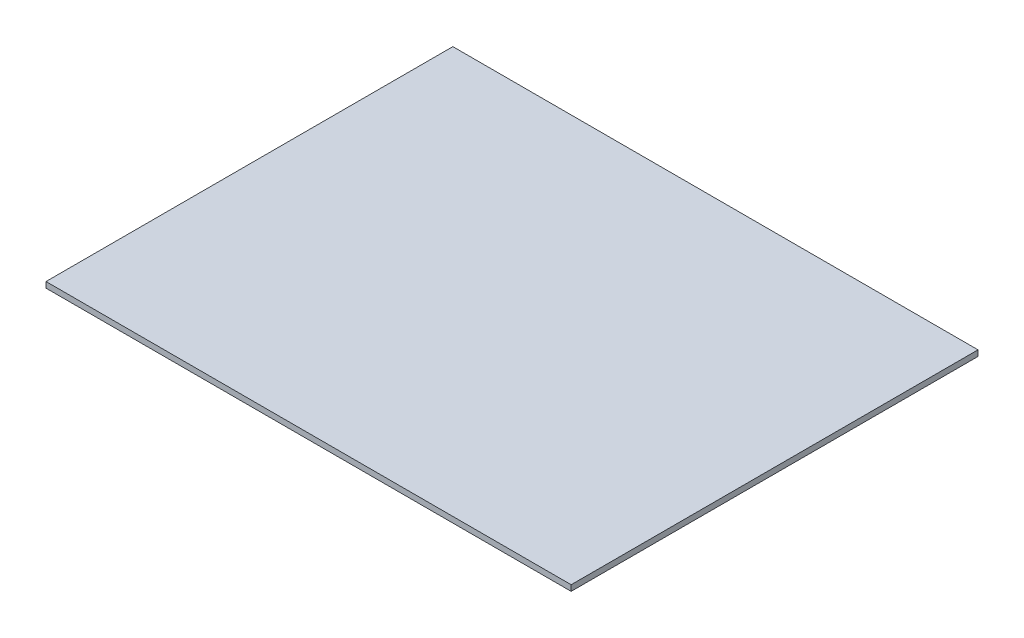
ISO-10303-21;
HEADER;
FILE_DESCRIPTION(('STEP AP214'),'2;1');
FILE_NAME('part.step','',(''),(''),'','','');
FILE_SCHEMA(('AUTOMOTIVE_DESIGN { 1 0 10303 214 1 1 1 1 }'));
ENDSEC;
DATA;
#1=APPLICATION_CONTEXT('core data for automotive mechanical design processes');
#2=APPLICATION_PROTOCOL_DEFINITION('international standard','automotive_design',2000,#1);
#3=PRODUCT_CONTEXT('',#1,'mechanical');
#4=PRODUCT('Part','Part','',(#3));
#5=PRODUCT_RELATED_PRODUCT_CATEGORY('part','',(#4));
#6=PRODUCT_DEFINITION_FORMATION('','',#4);
#7=PRODUCT_DEFINITION_CONTEXT('part definition',#1,'design');
#8=PRODUCT_DEFINITION('design','',#6,#7);
#9=PRODUCT_DEFINITION_SHAPE('','',#8);
#10=(LENGTH_UNIT() NAMED_UNIT(*) SI_UNIT(.MILLI.,.METRE.));
#11=(NAMED_UNIT(*) PLANE_ANGLE_UNIT() SI_UNIT($,.RADIAN.));
#12=(NAMED_UNIT(*) SI_UNIT($,.STERADIAN.) SOLID_ANGLE_UNIT());
#13=UNCERTAINTY_MEASURE_WITH_UNIT(LENGTH_MEASURE(1.E-05),#10,'distance_accuracy_value','');
#14=(GEOMETRIC_REPRESENTATION_CONTEXT(3) GLOBAL_UNCERTAINTY_ASSIGNED_CONTEXT((#13)) GLOBAL_UNIT_ASSIGNED_CONTEXT((#10,
#11,#12)) REPRESENTATION_CONTEXT('',''));
#15=CARTESIAN_POINT('',(0.,0.,0.));
#16=DIRECTION('',(0.,0.,1.));
#17=DIRECTION('',(1.,0.,0.));
#18=AXIS2_PLACEMENT_3D('',#15,#16,#17);
#19=CARTESIAN_POINT('',(91.,2.,70.5));
#20=DIRECTION('',(-1.,0.,0.));
#21=DIRECTION('',(0.,0.,1.));
#22=AXIS2_PLACEMENT_3D('',#19,#20,#21);
#23=PLANE('',#22);
#24=DIRECTION('',(0.,0.,-1.));
#25=VECTOR('',#24,1.);
#26=CARTESIAN_POINT('',(91.,0.,70.5));
#27=LINE('',#26,#25);
#28=CARTESIAN_POINT('',(91.,0.,70.5));
#29=VERTEX_POINT('',#28);
#30=CARTESIAN_POINT('',(91.,0.,-70.5));
#31=VERTEX_POINT('',#30);
#32=EDGE_CURVE('E113',#29,#31,#27,.T.);
#33=ORIENTED_EDGE('',*,*,#32,.T.);
#34=DIRECTION('',(0.,-1.,0.));
#35=VECTOR('',#34,1.);
#36=CARTESIAN_POINT('',(91.,2.,-70.5));
#37=LINE('',#36,#35);
#38=CARTESIAN_POINT('',(91.,2.,-70.5));
#39=VERTEX_POINT('',#38);
#40=EDGE_CURVE('E11',#39,#31,#37,.T.);
#41=ORIENTED_EDGE('',*,*,#40,.F.);
#42=DIRECTION('',(0.,0.,-1.));
#43=VECTOR('',#42,1.);
#44=CARTESIAN_POINT('',(91.,2.,70.5));
#45=LINE('',#44,#43);
#46=CARTESIAN_POINT('',(91.,2.,70.5));
#47=VERTEX_POINT('',#46);
#48=EDGE_CURVE('E97',#47,#39,#45,.T.);
#49=ORIENTED_EDGE('',*,*,#48,.F.);
#50=DIRECTION('',(0.,-1.,0.));
#51=VECTOR('',#50,1.);
#52=CARTESIAN_POINT('',(91.,2.,70.5));
#53=LINE('',#52,#51);
#54=EDGE_CURVE('E109',#47,#29,#53,.T.);
#55=ORIENTED_EDGE('',*,*,#54,.T.);
#56=EDGE_LOOP('',(#33,#41,#49,#55));
#57=FACE_BOUND('',#56,.T.);
#58=ADVANCED_FACE('F45',(#57),#23,.F.);
#59=CARTESIAN_POINT('',(-91.,2.,-70.5));
#60=DIRECTION('',(0.,0.,1.));
#61=DIRECTION('',(1.,0.,0.));
#62=AXIS2_PLACEMENT_3D('',#59,#60,#61);
#63=PLANE('',#62);
#64=DIRECTION('',(-1.,0.,0.));
#65=VECTOR('',#64,1.);
#66=CARTESIAN_POINT('',(-91.,0.,-70.5));
#67=LINE('',#66,#65);
#68=CARTESIAN_POINT('',(-91.,0.,-70.5));
#69=VERTEX_POINT('',#68);
#70=EDGE_CURVE('E102',#31,#69,#67,.T.);
#71=ORIENTED_EDGE('',*,*,#70,.T.);
#72=DIRECTION('',(0.,-1.,0.));
#73=VECTOR('',#72,1.);
#74=CARTESIAN_POINT('',(-91.,2.,-70.5));
#75=LINE('',#74,#73);
#76=CARTESIAN_POINT('',(-91.,2.,-70.5));
#77=VERTEX_POINT('',#76);
#78=EDGE_CURVE('E54',#77,#69,#75,.T.);
#79=ORIENTED_EDGE('',*,*,#78,.F.);
#80=DIRECTION('',(-1.,0.,0.));
#81=VECTOR('',#80,1.);
#82=CARTESIAN_POINT('',(-91.,2.,-70.5));
#83=LINE('',#82,#81);
#84=EDGE_CURVE('E92',#39,#77,#83,.T.);
#85=ORIENTED_EDGE('',*,*,#84,.F.);
#86=ORIENTED_EDGE('',*,*,#40,.T.);
#87=EDGE_LOOP('',(#71,#79,#85,#86));
#88=FACE_BOUND('',#87,.T.);
#89=ADVANCED_FACE('F101',(#88),#63,.F.);
#90=CARTESIAN_POINT('',(-91.,2.,70.5));
#91=DIRECTION('',(1.,0.,0.));
#92=DIRECTION('',(0.,0.,-1.));
#93=AXIS2_PLACEMENT_3D('',#90,#91,#92);
#94=PLANE('',#93);
#95=DIRECTION('',(0.,0.,1.));
#96=VECTOR('',#95,1.);
#97=CARTESIAN_POINT('',(-91.,0.,70.5));
#98=LINE('',#97,#96);
#99=CARTESIAN_POINT('',(-91.,0.,70.5));
#100=VERTEX_POINT('',#99);
#101=EDGE_CURVE('E79',#69,#100,#98,.T.);
#102=ORIENTED_EDGE('',*,*,#101,.T.);
#103=DIRECTION('',(0.,-1.,0.));
#104=VECTOR('',#103,1.);
#105=CARTESIAN_POINT('',(-91.,2.,70.5));
#106=LINE('',#105,#104);
#107=CARTESIAN_POINT('',(-91.,2.,70.5));
#108=VERTEX_POINT('',#107);
#109=EDGE_CURVE('E104',#108,#100,#106,.T.);
#110=ORIENTED_EDGE('',*,*,#109,.F.);
#111=DIRECTION('',(0.,0.,1.));
#112=VECTOR('',#111,1.);
#113=CARTESIAN_POINT('',(-91.,2.,70.5));
#114=LINE('',#113,#112);
#115=EDGE_CURVE('E95',#77,#108,#114,.T.);
#116=ORIENTED_EDGE('',*,*,#115,.F.);
#117=ORIENTED_EDGE('',*,*,#78,.T.);
#118=EDGE_LOOP('',(#102,#110,#116,#117));
#119=FACE_BOUND('',#118,.T.);
#120=ADVANCED_FACE('F105',(#119),#94,.F.);
#121=CARTESIAN_POINT('',(-91.,2.,70.5));
#122=DIRECTION('',(0.,0.,-1.));
#123=DIRECTION('',(-1.,0.,0.));
#124=AXIS2_PLACEMENT_3D('',#121,#122,#123);
#125=PLANE('',#124);
#126=DIRECTION('',(1.,0.,0.));
#127=VECTOR('',#126,1.);
#128=CARTESIAN_POINT('',(-91.,0.,70.5));
#129=LINE('',#128,#127);
#130=EDGE_CURVE('E85',#100,#29,#129,.T.);
#131=ORIENTED_EDGE('',*,*,#130,.T.);
#132=ORIENTED_EDGE('',*,*,#54,.F.);
#133=DIRECTION('',(1.,0.,0.));
#134=VECTOR('',#133,1.);
#135=CARTESIAN_POINT('',(-91.,2.,70.5));
#136=LINE('',#135,#134);
#137=EDGE_CURVE('E62',#108,#47,#136,.T.);
#138=ORIENTED_EDGE('',*,*,#137,.F.);
#139=ORIENTED_EDGE('',*,*,#109,.T.);
#140=EDGE_LOOP('',(#131,#132,#138,#139));
#141=FACE_BOUND('',#140,.T.);
#142=ADVANCED_FACE('F126',(#141),#125,.F.);
#143=CARTESIAN_POINT('',(0.,2.,0.));
#144=DIRECTION('',(0.,-1.,0.));
#145=DIRECTION('',(0.,0.,-1.));
#146=AXIS2_PLACEMENT_3D('',#143,#144,#145);
#147=PLANE('',#146);
#148=ORIENTED_EDGE('',*,*,#48,.T.);
#149=ORIENTED_EDGE('',*,*,#84,.T.);
#150=ORIENTED_EDGE('',*,*,#115,.T.);
#151=ORIENTED_EDGE('',*,*,#137,.T.);
#152=EDGE_LOOP('',(#148,#149,#150,#151));
#153=FACE_BOUND('',#152,.T.);
#154=ADVANCED_FACE('F93',(#153),#147,.F.);
#155=CARTESIAN_POINT('',(0.,0.,0.));
#156=DIRECTION('',(0.,-1.,0.));
#157=DIRECTION('',(0.,0.,-1.));
#158=AXIS2_PLACEMENT_3D('',#155,#156,#157);
#159=PLANE('',#158);
#160=ORIENTED_EDGE('',*,*,#32,.F.);
#161=ORIENTED_EDGE('',*,*,#130,.F.);
#162=ORIENTED_EDGE('',*,*,#101,.F.);
#163=ORIENTED_EDGE('',*,*,#70,.F.);
#164=EDGE_LOOP('',(#160,#161,#162,#163));
#165=FACE_BOUND('',#164,.T.);
#166=ADVANCED_FACE('F129',(#165),#159,.T.);
#167=CLOSED_SHELL('',(#58,#89,#120,#142,#154,#166));
#168=MANIFOLD_SOLID_BREP('B2',#167);
#169=ADVANCED_BREP_SHAPE_REPRESENTATION('',(#18,#168),#14);
#170=SHAPE_DEFINITION_REPRESENTATION(#9,#169);
ENDSEC;
END-ISO-10303-21;
